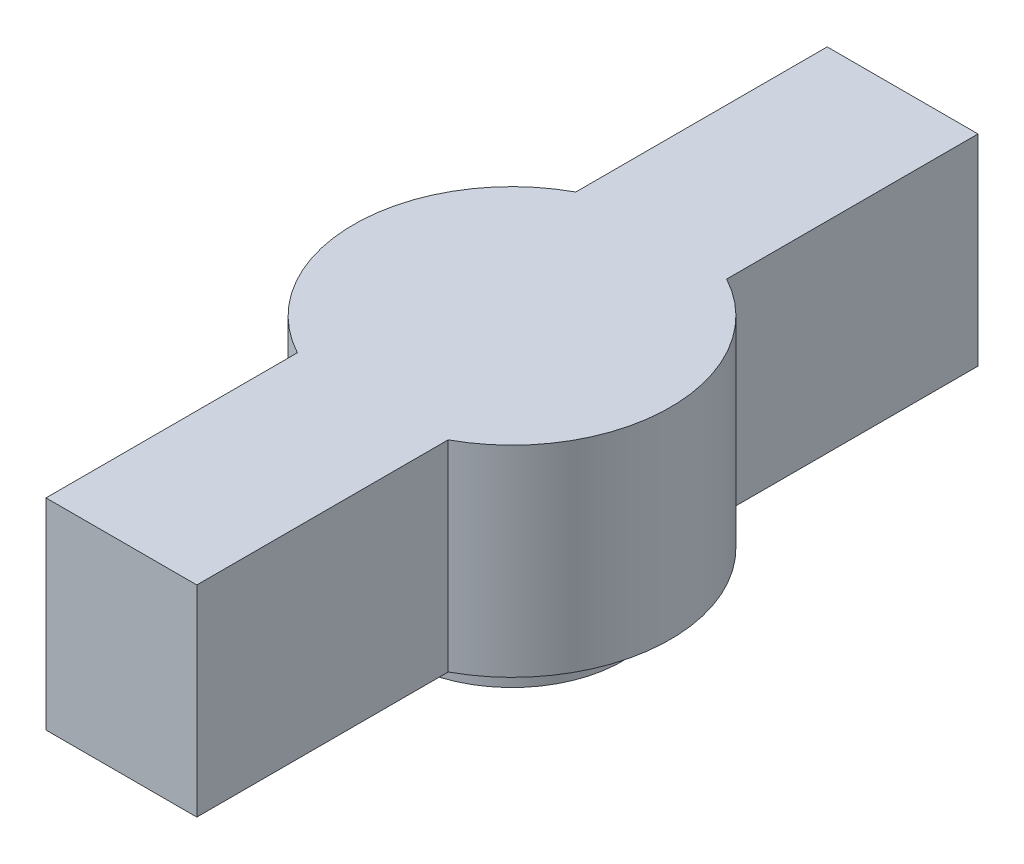
ISO-10303-21;
HEADER;
FILE_DESCRIPTION(('STEP AP214'),'2;1');
FILE_NAME('part.step','',(''),(''),'','','');
FILE_SCHEMA(('AUTOMOTIVE_DESIGN { 1 0 10303 214 1 1 1 1 }'));
ENDSEC;
DATA;
#1=APPLICATION_CONTEXT('core data for automotive mechanical design processes');
#2=APPLICATION_PROTOCOL_DEFINITION('international standard','automotive_design',2000,#1);
#3=PRODUCT_CONTEXT('',#1,'mechanical');
#4=PRODUCT('Part','Part','',(#3));
#5=PRODUCT_RELATED_PRODUCT_CATEGORY('part','',(#4));
#6=PRODUCT_DEFINITION_FORMATION('','',#4);
#7=PRODUCT_DEFINITION_CONTEXT('part definition',#1,'design');
#8=PRODUCT_DEFINITION('design','',#6,#7);
#9=PRODUCT_DEFINITION_SHAPE('','',#8);
#10=(LENGTH_UNIT() NAMED_UNIT(*) SI_UNIT(.MILLI.,.METRE.));
#11=(NAMED_UNIT(*) PLANE_ANGLE_UNIT() SI_UNIT($,.RADIAN.));
#12=(NAMED_UNIT(*) SI_UNIT($,.STERADIAN.) SOLID_ANGLE_UNIT());
#13=UNCERTAINTY_MEASURE_WITH_UNIT(LENGTH_MEASURE(1.E-05),#10,'distance_accuracy_value','');
#14=(GEOMETRIC_REPRESENTATION_CONTEXT(3) GLOBAL_UNCERTAINTY_ASSIGNED_CONTEXT((#13)) GLOBAL_UNIT_ASSIGNED_CONTEXT((#10,
#11,#12)) REPRESENTATION_CONTEXT('',''));
#15=CARTESIAN_POINT('',(0.,0.,0.));
#16=DIRECTION('',(0.,0.,1.));
#17=DIRECTION('',(1.,0.,0.));
#18=AXIS2_PLACEMENT_3D('',#15,#16,#17);
#19=CARTESIAN_POINT('',(1.27,2.54,0.));
#20=DIRECTION('',(-1.,0.,0.));
#21=DIRECTION('',(0.,0.,1.));
#22=AXIS2_PLACEMENT_3D('',#19,#20,#21);
#23=PLANE('',#22);
#24=DIRECTION('',(0.,0.,-1.));
#25=VECTOR('',#24,1.);
#26=CARTESIAN_POINT('',(1.27,0.,0.));
#27=LINE('',#26,#25);
#28=CARTESIAN_POINT('',(1.27,0.,11.5607342176639));
#29=VERTEX_POINT('',#28);
#30=CARTESIAN_POINT('',(1.27,0.,6.48073421766392));
#31=VERTEX_POINT('',#30);
#32=EDGE_CURVE('E147',#29,#31,#27,.T.);
#33=ORIENTED_EDGE('',*,*,#32,.T.);
#34=DIRECTION('',(0.,-1.,0.));
#35=VECTOR('',#34,1.);
#36=CARTESIAN_POINT('',(1.27,2.54,6.48073421766392));
#37=LINE('',#36,#35);
#38=CARTESIAN_POINT('',(1.27,2.54,6.48073421766392));
#39=VERTEX_POINT('',#38);
#40=EDGE_CURVE('E11',#39,#31,#37,.T.);
#41=ORIENTED_EDGE('',*,*,#40,.F.);
#42=DIRECTION('',(0.,0.,-1.));
#43=VECTOR('',#42,1.);
#44=CARTESIAN_POINT('',(1.27,2.54,0.));
#45=LINE('',#44,#43);
#46=CARTESIAN_POINT('',(1.27,2.54,11.5607342176639));
#47=VERTEX_POINT('',#46);
#48=EDGE_CURVE('E164',#47,#39,#45,.T.);
#49=ORIENTED_EDGE('',*,*,#48,.F.);
#50=DIRECTION('',(0.,-1.,0.));
#51=VECTOR('',#50,1.);
#52=CARTESIAN_POINT('',(1.27,2.54,11.5607342176639));
#53=LINE('',#52,#51);
#54=EDGE_CURVE('E146',#47,#29,#53,.T.);
#55=ORIENTED_EDGE('',*,*,#54,.T.);
#56=EDGE_LOOP('',(#33,#41,#49,#55));
#57=FACE_BOUND('',#56,.T.);
#58=ADVANCED_FACE('F40',(#57),#23,.F.);
#59=CARTESIAN_POINT('',(0.,2.54,0.));
#60=DIRECTION('',(0.,-1.,0.));
#61=DIRECTION('',(0.,0.,-1.));
#62=AXIS2_PLACEMENT_3D('',#59,#60,#61);
#63=CYLINDRICAL_SURFACE('',#62,6.604);
#64=CARTESIAN_POINT('',(0.,0.,0.));
#65=DIRECTION('',(0.,1.,0.));
#66=DIRECTION('',(0.,0.,1.));
#67=AXIS2_PLACEMENT_3D('',#64,#65,#66);
#68=CIRCLE('',#67,6.604);
#69=CARTESIAN_POINT('',(1.27,0.,-6.48073421766392));
#70=VERTEX_POINT('',#69);
#71=EDGE_CURVE('E150',#31,#70,#68,.T.);
#72=ORIENTED_EDGE('',*,*,#71,.T.);
#73=DIRECTION('',(0.,-1.,0.));
#74=VECTOR('',#73,1.);
#75=CARTESIAN_POINT('',(1.27,2.54,-6.48073421766392));
#76=LINE('',#75,#74);
#77=CARTESIAN_POINT('',(1.27,2.54,-6.48073421766392));
#78=VERTEX_POINT('',#77);
#79=EDGE_CURVE('E48',#78,#70,#76,.T.);
#80=ORIENTED_EDGE('',*,*,#79,.F.);
#81=CARTESIAN_POINT('',(0.,2.54,0.));
#82=DIRECTION('',(0.,1.,0.));
#83=DIRECTION('',(0.,0.,1.));
#84=AXIS2_PLACEMENT_3D('',#81,#82,#83);
#85=CIRCLE('',#84,6.604);
#86=EDGE_CURVE('E98',#39,#78,#85,.T.);
#87=ORIENTED_EDGE('',*,*,#86,.F.);
#88=ORIENTED_EDGE('',*,*,#40,.T.);
#89=EDGE_LOOP('',(#72,#80,#87,#88));
#90=FACE_BOUND('',#89,.T.);
#91=ADVANCED_FACE('F174',(#90),#63,.T.);
#92=CARTESIAN_POINT('',(1.27,2.54,0.));
#93=DIRECTION('',(1.,0.,0.));
#94=DIRECTION('',(0.,0.,-1.));
#95=AXIS2_PLACEMENT_3D('',#92,#93,#94);
#96=PLANE('',#95);
#97=DIRECTION('',(0.,0.,1.));
#98=VECTOR('',#97,1.);
#99=CARTESIAN_POINT('',(1.27,0.,0.));
#100=LINE('',#99,#98);
#101=CARTESIAN_POINT('',(1.27,0.,-11.5607342176639));
#102=VERTEX_POINT('',#101);
#103=EDGE_CURVE('E154',#102,#70,#100,.T.);
#104=ORIENTED_EDGE('',*,*,#103,.F.);
#105=DIRECTION('',(0.,-1.,0.));
#106=VECTOR('',#105,1.);
#107=CARTESIAN_POINT('',(1.27,2.54,-11.5607342176639));
#108=LINE('',#107,#106);
#109=CARTESIAN_POINT('',(1.27,2.54,-11.5607342176639));
#110=VERTEX_POINT('',#109);
#111=EDGE_CURVE('E169',#110,#102,#108,.T.);
#112=ORIENTED_EDGE('',*,*,#111,.F.);
#113=DIRECTION('',(0.,0.,1.));
#114=VECTOR('',#113,1.);
#115=CARTESIAN_POINT('',(1.27,2.54,0.));
#116=LINE('',#115,#114);
#117=EDGE_CURVE('E139',#110,#78,#116,.T.);
#118=ORIENTED_EDGE('',*,*,#117,.T.);
#119=ORIENTED_EDGE('',*,*,#79,.T.);
#120=EDGE_LOOP('',(#104,#112,#118,#119));
#121=FACE_BOUND('',#120,.T.);
#122=ADVANCED_FACE('F173',(#121),#96,.T.);
#123=CARTESIAN_POINT('',(0.,2.54,-11.5607342176639));
#124=DIRECTION('',(0.,0.,-1.));
#125=DIRECTION('',(-1.,0.,0.));
#126=AXIS2_PLACEMENT_3D('',#123,#124,#125);
#127=PLANE('',#126);
#128=DIRECTION('',(1.,0.,0.));
#129=VECTOR('',#128,1.);
#130=CARTESIAN_POINT('',(0.,0.,-11.5607342176639));
#131=LINE('',#130,#129);
#132=CARTESIAN_POINT('',(-1.27,0.,-11.5607342176639));
#133=VERTEX_POINT('',#132);
#134=EDGE_CURVE('E158',#133,#102,#131,.T.);
#135=ORIENTED_EDGE('',*,*,#134,.F.);
#136=DIRECTION('',(0.,-1.,0.));
#137=VECTOR('',#136,1.);
#138=CARTESIAN_POINT('',(-1.27,2.54,-11.5607342176639));
#139=LINE('',#138,#137);
#140=CARTESIAN_POINT('',(-1.27,2.54,-11.5607342176639));
#141=VERTEX_POINT('',#140);
#142=EDGE_CURVE('E123',#141,#133,#139,.T.);
#143=ORIENTED_EDGE('',*,*,#142,.F.);
#144=DIRECTION('',(1.,0.,0.));
#145=VECTOR('',#144,1.);
#146=CARTESIAN_POINT('',(0.,2.54,-11.5607342176639));
#147=LINE('',#146,#145);
#148=EDGE_CURVE('E137',#141,#110,#147,.T.);
#149=ORIENTED_EDGE('',*,*,#148,.T.);
#150=ORIENTED_EDGE('',*,*,#111,.T.);
#151=EDGE_LOOP('',(#135,#143,#149,#150));
#152=FACE_BOUND('',#151,.T.);
#153=ADVANCED_FACE('F180',(#152),#127,.T.);
#154=CARTESIAN_POINT('',(-1.27,2.54,0.));
#155=DIRECTION('',(-1.,0.,0.));
#156=DIRECTION('',(0.,0.,1.));
#157=AXIS2_PLACEMENT_3D('',#154,#155,#156);
#158=PLANE('',#157);
#159=DIRECTION('',(0.,0.,-1.));
#160=VECTOR('',#159,1.);
#161=CARTESIAN_POINT('',(-1.27,0.,0.));
#162=LINE('',#161,#160);
#163=CARTESIAN_POINT('',(-1.27,0.,-6.48073421766392));
#164=VERTEX_POINT('',#163);
#165=EDGE_CURVE('E120',#164,#133,#162,.T.);
#166=ORIENTED_EDGE('',*,*,#165,.F.);
#167=DIRECTION('',(0.,-1.,0.));
#168=VECTOR('',#167,1.);
#169=CARTESIAN_POINT('',(-1.27,2.54,-6.48073421766392));
#170=LINE('',#169,#168);
#171=CARTESIAN_POINT('',(-1.27,2.54,-6.48073421766392));
#172=VERTEX_POINT('',#171);
#173=EDGE_CURVE('E113',#172,#164,#170,.T.);
#174=ORIENTED_EDGE('',*,*,#173,.F.);
#175=DIRECTION('',(0.,0.,-1.));
#176=VECTOR('',#175,1.);
#177=CARTESIAN_POINT('',(-1.27,2.54,0.));
#178=LINE('',#177,#176);
#179=EDGE_CURVE('E117',#172,#141,#178,.T.);
#180=ORIENTED_EDGE('',*,*,#179,.T.);
#181=ORIENTED_EDGE('',*,*,#142,.T.);
#182=EDGE_LOOP('',(#166,#174,#180,#181));
#183=FACE_BOUND('',#182,.T.);
#184=ADVANCED_FACE('F115',(#183),#158,.T.);
#185=CARTESIAN_POINT('',(-1.27,0.,6.48073421766392));
#186=VERTEX_POINT('',#185);
#187=EDGE_CURVE('E155',#164,#186,#68,.T.);
#188=ORIENTED_EDGE('',*,*,#187,.T.);
#189=DIRECTION('',(0.,-1.,0.));
#190=VECTOR('',#189,1.);
#191=CARTESIAN_POINT('',(-1.27,2.54,6.48073421766392));
#192=LINE('',#191,#190);
#193=CARTESIAN_POINT('',(-1.27,2.54,6.48073421766392));
#194=VERTEX_POINT('',#193);
#195=EDGE_CURVE('E124',#194,#186,#192,.T.);
#196=ORIENTED_EDGE('',*,*,#195,.F.);
#197=EDGE_CURVE('E127',#172,#194,#85,.T.);
#198=ORIENTED_EDGE('',*,*,#197,.F.);
#199=ORIENTED_EDGE('',*,*,#173,.T.);
#200=EDGE_LOOP('',(#188,#196,#198,#199));
#201=FACE_BOUND('',#200,.T.);
#202=ADVANCED_FACE('F128',(#201),#63,.T.);
#203=CARTESIAN_POINT('',(-1.27,2.54,0.));
#204=DIRECTION('',(1.,0.,0.));
#205=DIRECTION('',(0.,0.,-1.));
#206=AXIS2_PLACEMENT_3D('',#203,#204,#205);
#207=PLANE('',#206);
#208=DIRECTION('',(0.,0.,1.));
#209=VECTOR('',#208,1.);
#210=CARTESIAN_POINT('',(-1.27,0.,0.));
#211=LINE('',#210,#209);
#212=CARTESIAN_POINT('',(-1.27,0.,11.5607342176639));
#213=VERTEX_POINT('',#212);
#214=EDGE_CURVE('E84',#186,#213,#211,.T.);
#215=ORIENTED_EDGE('',*,*,#214,.T.);
#216=DIRECTION('',(0.,-1.,0.));
#217=VECTOR('',#216,1.);
#218=CARTESIAN_POINT('',(-1.27,2.54,11.5607342176639));
#219=LINE('',#218,#217);
#220=CARTESIAN_POINT('',(-1.27,2.54,11.5607342176639));
#221=VERTEX_POINT('',#220);
#222=EDGE_CURVE('E56',#221,#213,#219,.T.);
#223=ORIENTED_EDGE('',*,*,#222,.F.);
#224=DIRECTION('',(0.,0.,1.));
#225=VECTOR('',#224,1.);
#226=CARTESIAN_POINT('',(-1.27,2.54,0.));
#227=LINE('',#226,#225);
#228=EDGE_CURVE('E131',#194,#221,#227,.T.);
#229=ORIENTED_EDGE('',*,*,#228,.F.);
#230=ORIENTED_EDGE('',*,*,#195,.T.);
#231=EDGE_LOOP('',(#215,#223,#229,#230));
#232=FACE_BOUND('',#231,.T.);
#233=ADVANCED_FACE('F314',(#232),#207,.F.);
#234=CARTESIAN_POINT('',(0.,2.54,11.5607342176639));
#235=DIRECTION('',(0.,0.,-1.));
#236=DIRECTION('',(-1.,0.,0.));
#237=AXIS2_PLACEMENT_3D('',#234,#235,#236);
#238=PLANE('',#237);
#239=DIRECTION('',(1.,0.,0.));
#240=VECTOR('',#239,1.);
#241=CARTESIAN_POINT('',(0.,0.,11.5607342176639));
#242=LINE('',#241,#240);
#243=EDGE_CURVE('E90',#213,#29,#242,.T.);
#244=ORIENTED_EDGE('',*,*,#243,.T.);
#245=ORIENTED_EDGE('',*,*,#54,.F.);
#246=DIRECTION('',(1.,0.,0.));
#247=VECTOR('',#246,1.);
#248=CARTESIAN_POINT('',(0.,2.54,11.5607342176639));
#249=LINE('',#248,#247);
#250=EDGE_CURVE('E144',#221,#47,#249,.T.);
#251=ORIENTED_EDGE('',*,*,#250,.F.);
#252=ORIENTED_EDGE('',*,*,#222,.T.);
#253=EDGE_LOOP('',(#244,#245,#251,#252));
#254=FACE_BOUND('',#253,.T.);
#255=ADVANCED_FACE('F303',(#254),#238,.F.);
#256=CARTESIAN_POINT('',(0.,0.,0.));
#257=DIRECTION('',(0.,1.,0.));
#258=DIRECTION('',(0.,0.,1.));
#259=AXIS2_PLACEMENT_3D('',#256,#257,#258);
#260=PLANE('',#259);
#261=ORIENTED_EDGE('',*,*,#32,.F.);
#262=ORIENTED_EDGE('',*,*,#243,.F.);
#263=ORIENTED_EDGE('',*,*,#214,.F.);
#264=ORIENTED_EDGE('',*,*,#187,.F.);
#265=ORIENTED_EDGE('',*,*,#165,.T.);
#266=ORIENTED_EDGE('',*,*,#134,.T.);
#267=ORIENTED_EDGE('',*,*,#103,.T.);
#268=ORIENTED_EDGE('',*,*,#71,.F.);
#269=EDGE_LOOP('',(#261,#262,#263,#264,#265,#266,#267,#268));
#270=FACE_BOUND('',#269,.T.);
#271=ADVANCED_FACE('F177',(#270),#260,.F.);
#272=CARTESIAN_POINT('',(0.,2.54,0.));
#273=DIRECTION('',(0.,1.,0.));
#274=DIRECTION('',(0.,0.,1.));
#275=AXIS2_PLACEMENT_3D('',#272,#273,#274);
#276=PLANE('',#275);
#277=CARTESIAN_POINT('',(0.,2.54,0.));
#278=DIRECTION('',(0.,1.,0.));
#279=DIRECTION('',(0.,0.,1.));
#280=AXIS2_PLACEMENT_3D('',#277,#278,#279);
#281=CIRCLE('',#280,9.45);
#282=CARTESIAN_POINT('',(-4.5,2.54,-8.30978339067872));
#283=VERTEX_POINT('',#282);
#284=CARTESIAN_POINT('',(-4.5,2.54,8.30978339067872));
#285=VERTEX_POINT('',#284);
#286=EDGE_CURVE('E230',#283,#285,#281,.T.);
#287=ORIENTED_EDGE('',*,*,#286,.F.);
#288=DIRECTION('',(0.,0.,1.));
#289=VECTOR('',#288,1.);
#290=CARTESIAN_POINT('',(-4.5,2.54,-8.30978339067872));
#291=LINE('',#290,#289);
#292=CARTESIAN_POINT('',(-4.5,2.54,-23.3097833906787));
#293=VERTEX_POINT('',#292);
#294=EDGE_CURVE('E208',#293,#283,#291,.T.);
#295=ORIENTED_EDGE('',*,*,#294,.F.);
#296=DIRECTION('',(-1.,0.,0.));
#297=VECTOR('',#296,1.);
#298=CARTESIAN_POINT('',(-4.5,2.54,-23.3097833906787));
#299=LINE('',#298,#297);
#300=CARTESIAN_POINT('',(4.5,2.54,-23.3097833906787));
#301=VERTEX_POINT('',#300);
#302=EDGE_CURVE('E212',#301,#293,#299,.T.);
#303=ORIENTED_EDGE('',*,*,#302,.F.);
#304=DIRECTION('',(0.,0.,-1.));
#305=VECTOR('',#304,1.);
#306=CARTESIAN_POINT('',(4.5,2.54,-23.3097833906787));
#307=LINE('',#306,#305);
#308=CARTESIAN_POINT('',(4.5,2.54,-8.30978339067872));
#309=VERTEX_POINT('',#308);
#310=EDGE_CURVE('E215',#309,#301,#307,.T.);
#311=ORIENTED_EDGE('',*,*,#310,.F.);
#312=CARTESIAN_POINT('',(0.,2.54,0.));
#313=DIRECTION('',(0.,1.,0.));
#314=DIRECTION('',(0.,0.,1.));
#315=AXIS2_PLACEMENT_3D('',#312,#313,#314);
#316=CIRCLE('',#315,9.45);
#317=CARTESIAN_POINT('',(4.5,2.54,8.30978339067872));
#318=VERTEX_POINT('',#317);
#319=EDGE_CURVE('E218',#318,#309,#316,.T.);
#320=ORIENTED_EDGE('',*,*,#319,.F.);
#321=DIRECTION('',(0.,0.,-1.));
#322=VECTOR('',#321,1.);
#323=CARTESIAN_POINT('',(4.5,2.54,23.3097833906787));
#324=LINE('',#323,#322);
#325=CARTESIAN_POINT('',(4.5,2.54,23.3097833906787));
#326=VERTEX_POINT('',#325);
#327=EDGE_CURVE('E221',#326,#318,#324,.T.);
#328=ORIENTED_EDGE('',*,*,#327,.F.);
#329=DIRECTION('',(1.,0.,0.));
#330=VECTOR('',#329,1.);
#331=CARTESIAN_POINT('',(-4.5,2.54,23.3097833906787));
#332=LINE('',#331,#330);
#333=CARTESIAN_POINT('',(-4.5,2.54,23.3097833906787));
#334=VERTEX_POINT('',#333);
#335=EDGE_CURVE('E224',#334,#326,#332,.T.);
#336=ORIENTED_EDGE('',*,*,#335,.F.);
#337=DIRECTION('',(0.,0.,1.));
#338=VECTOR('',#337,1.);
#339=CARTESIAN_POINT('',(-4.5,2.54,8.30978339067872));
#340=LINE('',#339,#338);
#341=EDGE_CURVE('E227',#285,#334,#340,.T.);
#342=ORIENTED_EDGE('',*,*,#341,.F.);
#343=EDGE_LOOP('',(#287,#295,#303,#311,#320,#328,#336,#342));
#344=FACE_BOUND('',#343,.T.);
#345=ORIENTED_EDGE('',*,*,#250,.T.);
#346=ORIENTED_EDGE('',*,*,#48,.T.);
#347=ORIENTED_EDGE('',*,*,#86,.T.);
#348=ORIENTED_EDGE('',*,*,#117,.F.);
#349=ORIENTED_EDGE('',*,*,#148,.F.);
#350=ORIENTED_EDGE('',*,*,#179,.F.);
#351=ORIENTED_EDGE('',*,*,#197,.T.);
#352=ORIENTED_EDGE('',*,*,#228,.T.);
#353=EDGE_LOOP('',(#345,#346,#347,#348,#349,#350,#351,#352));
#354=FACE_BOUND('',#353,.T.);
#355=ADVANCED_FACE('F134',(#344,#354),#276,.F.);
#356=CARTESIAN_POINT('',(0.,14.54,0.));
#357=DIRECTION('',(0.,-1.,0.));
#358=DIRECTION('',(0.,0.,-1.));
#359=AXIS2_PLACEMENT_3D('',#356,#357,#358);
#360=CYLINDRICAL_SURFACE('',#359,9.45);
#361=ORIENTED_EDGE('',*,*,#286,.T.);
#362=DIRECTION('',(0.,-1.,0.));
#363=VECTOR('',#362,1.);
#364=CARTESIAN_POINT('',(-4.5,14.54,8.30978339067872));
#365=LINE('',#364,#363);
#366=CARTESIAN_POINT('',(-4.5,14.54,8.30978339067872));
#367=VERTEX_POINT('',#366);
#368=EDGE_CURVE('E151',#367,#285,#365,.T.);
#369=ORIENTED_EDGE('',*,*,#368,.F.);
#370=CARTESIAN_POINT('',(0.,14.54,0.));
#371=DIRECTION('',(0.,1.,0.));
#372=DIRECTION('',(0.,0.,1.));
#373=AXIS2_PLACEMENT_3D('',#370,#371,#372);
#374=CIRCLE('',#373,9.45);
#375=CARTESIAN_POINT('',(-4.5,14.54,-8.30978339067872));
#376=VERTEX_POINT('',#375);
#377=EDGE_CURVE('E211',#376,#367,#374,.T.);
#378=ORIENTED_EDGE('',*,*,#377,.F.);
#379=DIRECTION('',(0.,-1.,0.));
#380=VECTOR('',#379,1.);
#381=CARTESIAN_POINT('',(-4.5,14.54,-8.30978339067872));
#382=LINE('',#381,#380);
#383=EDGE_CURVE('E204',#376,#283,#382,.T.);
#384=ORIENTED_EDGE('',*,*,#383,.T.);
#385=EDGE_LOOP('',(#361,#369,#378,#384));
#386=FACE_BOUND('',#385,.T.);
#387=ADVANCED_FACE('F268',(#386),#360,.T.);
#388=CARTESIAN_POINT('',(-4.5,14.54,8.30978339067872));
#389=DIRECTION('',(1.,0.,0.));
#390=DIRECTION('',(0.,0.,-1.));
#391=AXIS2_PLACEMENT_3D('',#388,#389,#390);
#392=PLANE('',#391);
#393=ORIENTED_EDGE('',*,*,#341,.T.);
#394=DIRECTION('',(0.,-1.,0.));
#395=VECTOR('',#394,1.);
#396=CARTESIAN_POINT('',(-4.5,14.54,23.3097833906787));
#397=LINE('',#396,#395);
#398=CARTESIAN_POINT('',(-4.5,14.54,23.3097833906787));
#399=VERTEX_POINT('',#398);
#400=EDGE_CURVE('E186',#399,#334,#397,.T.);
#401=ORIENTED_EDGE('',*,*,#400,.F.);
#402=DIRECTION('',(0.,0.,1.));
#403=VECTOR('',#402,1.);
#404=CARTESIAN_POINT('',(-4.5,14.54,8.30978339067872));
#405=LINE('',#404,#403);
#406=EDGE_CURVE('E250',#367,#399,#405,.T.);
#407=ORIENTED_EDGE('',*,*,#406,.F.);
#408=ORIENTED_EDGE('',*,*,#368,.T.);
#409=EDGE_LOOP('',(#393,#401,#407,#408));
#410=FACE_BOUND('',#409,.T.);
#411=ADVANCED_FACE('F272',(#410),#392,.F.);
#412=CARTESIAN_POINT('',(-4.5,14.54,23.3097833906787));
#413=DIRECTION('',(0.,0.,-1.));
#414=DIRECTION('',(-1.,0.,0.));
#415=AXIS2_PLACEMENT_3D('',#412,#413,#414);
#416=PLANE('',#415);
#417=ORIENTED_EDGE('',*,*,#335,.T.);
#418=DIRECTION('',(0.,-1.,0.));
#419=VECTOR('',#418,1.);
#420=CARTESIAN_POINT('',(4.5,14.54,23.3097833906787));
#421=LINE('',#420,#419);
#422=CARTESIAN_POINT('',(4.5,14.54,23.3097833906787));
#423=VERTEX_POINT('',#422);
#424=EDGE_CURVE('E189',#423,#326,#421,.T.);
#425=ORIENTED_EDGE('',*,*,#424,.F.);
#426=DIRECTION('',(1.,0.,0.));
#427=VECTOR('',#426,1.);
#428=CARTESIAN_POINT('',(-4.5,14.54,23.3097833906787));
#429=LINE('',#428,#427);
#430=EDGE_CURVE('E247',#399,#423,#429,.T.);
#431=ORIENTED_EDGE('',*,*,#430,.F.);
#432=ORIENTED_EDGE('',*,*,#400,.T.);
#433=EDGE_LOOP('',(#417,#425,#431,#432));
#434=FACE_BOUND('',#433,.T.);
#435=ADVANCED_FACE('F372',(#434),#416,.F.);
#436=CARTESIAN_POINT('',(4.5,14.54,23.3097833906787));
#437=DIRECTION('',(-1.,0.,0.));
#438=DIRECTION('',(0.,0.,1.));
#439=AXIS2_PLACEMENT_3D('',#436,#437,#438);
#440=PLANE('',#439);
#441=ORIENTED_EDGE('',*,*,#327,.T.);
#442=DIRECTION('',(0.,-1.,0.));
#443=VECTOR('',#442,1.);
#444=CARTESIAN_POINT('',(4.5,14.54,8.30978339067872));
#445=LINE('',#444,#443);
#446=CARTESIAN_POINT('',(4.5,14.54,8.30978339067872));
#447=VERTEX_POINT('',#446);
#448=EDGE_CURVE('E192',#447,#318,#445,.T.);
#449=ORIENTED_EDGE('',*,*,#448,.F.);
#450=DIRECTION('',(0.,0.,-1.));
#451=VECTOR('',#450,1.);
#452=CARTESIAN_POINT('',(4.5,14.54,23.3097833906787));
#453=LINE('',#452,#451);
#454=EDGE_CURVE('E244',#423,#447,#453,.T.);
#455=ORIENTED_EDGE('',*,*,#454,.F.);
#456=ORIENTED_EDGE('',*,*,#424,.T.);
#457=EDGE_LOOP('',(#441,#449,#455,#456));
#458=FACE_BOUND('',#457,.T.);
#459=ADVANCED_FACE('F381',(#458),#440,.F.);
#460=CARTESIAN_POINT('',(0.,14.54,0.));
#461=DIRECTION('',(0.,-1.,0.));
#462=DIRECTION('',(0.,0.,-1.));
#463=AXIS2_PLACEMENT_3D('',#460,#461,#462);
#464=CYLINDRICAL_SURFACE('',#463,9.45);
#465=ORIENTED_EDGE('',*,*,#319,.T.);
#466=DIRECTION('',(0.,-1.,0.));
#467=VECTOR('',#466,1.);
#468=CARTESIAN_POINT('',(4.5,14.54,-8.30978339067872));
#469=LINE('',#468,#467);
#470=CARTESIAN_POINT('',(4.5,14.54,-8.30978339067872));
#471=VERTEX_POINT('',#470);
#472=EDGE_CURVE('E195',#471,#309,#469,.T.);
#473=ORIENTED_EDGE('',*,*,#472,.F.);
#474=CARTESIAN_POINT('',(0.,14.54,0.));
#475=DIRECTION('',(0.,1.,0.));
#476=DIRECTION('',(0.,0.,1.));
#477=AXIS2_PLACEMENT_3D('',#474,#475,#476);
#478=CIRCLE('',#477,9.45);
#479=EDGE_CURVE('E241',#447,#471,#478,.T.);
#480=ORIENTED_EDGE('',*,*,#479,.F.);
#481=ORIENTED_EDGE('',*,*,#448,.T.);
#482=EDGE_LOOP('',(#465,#473,#480,#481));
#483=FACE_BOUND('',#482,.T.);
#484=ADVANCED_FACE('F391',(#483),#464,.T.);
#485=CARTESIAN_POINT('',(4.5,14.54,-23.3097833906787));
#486=DIRECTION('',(-1.,0.,0.));
#487=DIRECTION('',(0.,0.,1.));
#488=AXIS2_PLACEMENT_3D('',#485,#486,#487);
#489=PLANE('',#488);
#490=ORIENTED_EDGE('',*,*,#310,.T.);
#491=DIRECTION('',(0.,-1.,0.));
#492=VECTOR('',#491,1.);
#493=CARTESIAN_POINT('',(4.5,14.54,-23.3097833906787));
#494=LINE('',#493,#492);
#495=CARTESIAN_POINT('',(4.5,14.54,-23.3097833906787));
#496=VERTEX_POINT('',#495);
#497=EDGE_CURVE('E198',#496,#301,#494,.T.);
#498=ORIENTED_EDGE('',*,*,#497,.F.);
#499=DIRECTION('',(0.,0.,-1.));
#500=VECTOR('',#499,1.);
#501=CARTESIAN_POINT('',(4.5,14.54,-23.3097833906787));
#502=LINE('',#501,#500);
#503=EDGE_CURVE('E238',#471,#496,#502,.T.);
#504=ORIENTED_EDGE('',*,*,#503,.F.);
#505=ORIENTED_EDGE('',*,*,#472,.T.);
#506=EDGE_LOOP('',(#490,#498,#504,#505));
#507=FACE_BOUND('',#506,.T.);
#508=ADVANCED_FACE('F401',(#507),#489,.F.);
#509=CARTESIAN_POINT('',(-4.5,14.54,-23.3097833906787));
#510=DIRECTION('',(0.,0.,1.));
#511=DIRECTION('',(1.,0.,0.));
#512=AXIS2_PLACEMENT_3D('',#509,#510,#511);
#513=PLANE('',#512);
#514=ORIENTED_EDGE('',*,*,#302,.T.);
#515=DIRECTION('',(0.,-1.,0.));
#516=VECTOR('',#515,1.);
#517=CARTESIAN_POINT('',(-4.5,14.54,-23.3097833906787));
#518=LINE('',#517,#516);
#519=CARTESIAN_POINT('',(-4.5,14.54,-23.3097833906787));
#520=VERTEX_POINT('',#519);
#521=EDGE_CURVE('E201',#520,#293,#518,.T.);
#522=ORIENTED_EDGE('',*,*,#521,.F.);
#523=DIRECTION('',(-1.,0.,0.));
#524=VECTOR('',#523,1.);
#525=CARTESIAN_POINT('',(-4.5,14.54,-23.3097833906787));
#526=LINE('',#525,#524);
#527=EDGE_CURVE('E235',#496,#520,#526,.T.);
#528=ORIENTED_EDGE('',*,*,#527,.F.);
#529=ORIENTED_EDGE('',*,*,#497,.T.);
#530=EDGE_LOOP('',(#514,#522,#528,#529));
#531=FACE_BOUND('',#530,.T.);
#532=ADVANCED_FACE('F411',(#531),#513,.F.);
#533=CARTESIAN_POINT('',(-4.5,14.54,-8.30978339067872));
#534=DIRECTION('',(1.,0.,0.));
#535=DIRECTION('',(0.,0.,-1.));
#536=AXIS2_PLACEMENT_3D('',#533,#534,#535);
#537=PLANE('',#536);
#538=ORIENTED_EDGE('',*,*,#294,.T.);
#539=ORIENTED_EDGE('',*,*,#383,.F.);
#540=DIRECTION('',(0.,0.,1.));
#541=VECTOR('',#540,1.);
#542=CARTESIAN_POINT('',(-4.5,14.54,-8.30978339067872));
#543=LINE('',#542,#541);
#544=EDGE_CURVE('E207',#520,#376,#543,.T.);
#545=ORIENTED_EDGE('',*,*,#544,.F.);
#546=ORIENTED_EDGE('',*,*,#521,.T.);
#547=EDGE_LOOP('',(#538,#539,#545,#546));
#548=FACE_BOUND('',#547,.T.);
#549=ADVANCED_FACE('F293',(#548),#537,.F.);
#550=CARTESIAN_POINT('',(0.,14.54,0.));
#551=DIRECTION('',(0.,1.,0.));
#552=DIRECTION('',(0.,0.,1.));
#553=AXIS2_PLACEMENT_3D('',#550,#551,#552);
#554=PLANE('',#553);
#555=ORIENTED_EDGE('',*,*,#377,.T.);
#556=ORIENTED_EDGE('',*,*,#406,.T.);
#557=ORIENTED_EDGE('',*,*,#430,.T.);
#558=ORIENTED_EDGE('',*,*,#454,.T.);
#559=ORIENTED_EDGE('',*,*,#479,.T.);
#560=ORIENTED_EDGE('',*,*,#503,.T.);
#561=ORIENTED_EDGE('',*,*,#527,.T.);
#562=ORIENTED_EDGE('',*,*,#544,.T.);
#563=EDGE_LOOP('',(#555,#556,#557,#558,#559,#560,#561,#562));
#564=FACE_BOUND('',#563,.T.);
#565=ADVANCED_FACE('F258',(#564),#554,.T.);
#566=CLOSED_SHELL('',(#58,#91,#122,#153,#184,#202,#233,#255,#271,#355,#387,#411,#435,#459,#484,
#508,#532,#549,#565));
#567=MANIFOLD_SOLID_BREP('B2',#566);
#568=ADVANCED_BREP_SHAPE_REPRESENTATION('',(#18,#567),#14);
#569=SHAPE_DEFINITION_REPRESENTATION(#9,#568);
ENDSEC;
END-ISO-10303-21;
